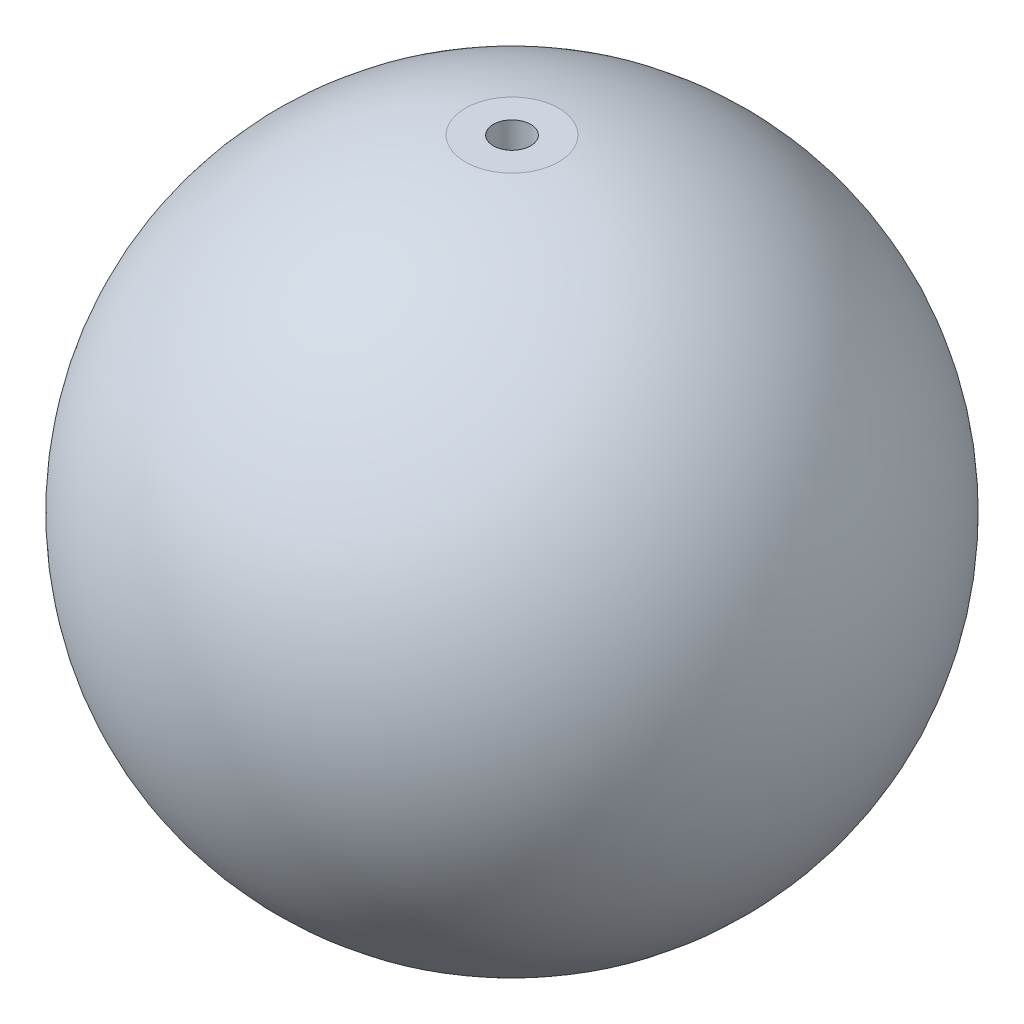
ISO-10303-21;
HEADER;
FILE_DESCRIPTION(('STEP AP214'),'2;1');
FILE_NAME('part.step','',(''),(''),'','','');
FILE_SCHEMA(('AUTOMOTIVE_DESIGN { 1 0 10303 214 1 1 1 1 }'));
ENDSEC;
DATA;
#1=APPLICATION_CONTEXT('core data for automotive mechanical design processes');
#2=APPLICATION_PROTOCOL_DEFINITION('international standard','automotive_design',2000,#1);
#3=PRODUCT_CONTEXT('',#1,'mechanical');
#4=PRODUCT('Part','Part','',(#3));
#5=PRODUCT_RELATED_PRODUCT_CATEGORY('part','',(#4));
#6=PRODUCT_DEFINITION_FORMATION('','',#4);
#7=PRODUCT_DEFINITION_CONTEXT('part definition',#1,'design');
#8=PRODUCT_DEFINITION('design','',#6,#7);
#9=PRODUCT_DEFINITION_SHAPE('','',#8);
#10=(LENGTH_UNIT() NAMED_UNIT(*) SI_UNIT(.MILLI.,.METRE.));
#11=(NAMED_UNIT(*) PLANE_ANGLE_UNIT() SI_UNIT($,.RADIAN.));
#12=(NAMED_UNIT(*) SI_UNIT($,.STERADIAN.) SOLID_ANGLE_UNIT());
#13=UNCERTAINTY_MEASURE_WITH_UNIT(LENGTH_MEASURE(1.E-05),#10,'distance_accuracy_value','');
#14=(GEOMETRIC_REPRESENTATION_CONTEXT(3) GLOBAL_UNCERTAINTY_ASSIGNED_CONTEXT((#13)) GLOBAL_UNIT_ASSIGNED_CONTEXT((#10,
#11,#12)) REPRESENTATION_CONTEXT('',''));
#15=CARTESIAN_POINT('',(0.,0.,0.));
#16=DIRECTION('',(0.,0.,1.));
#17=DIRECTION('',(1.,0.,0.));
#18=AXIS2_PLACEMENT_3D('',#15,#16,#17);
#19=CARTESIAN_POINT('',(0.,0.,0.));
#20=DIRECTION('',(0.,-1.,0.));
#21=DIRECTION('',(0.,0.,-1.));
#22=AXIS2_PLACEMENT_3D('',#19,#20,#21);
#23=CYLINDRICAL_SURFACE('',#22,2.);
#24=CARTESIAN_POINT('',(0.,70.,0.));
#25=DIRECTION('',(0.,-1.,0.));
#26=DIRECTION('',(0.,0.,-1.));
#27=AXIS2_PLACEMENT_3D('',#24,#25,#26);
#28=CIRCLE('',#27,2.);
#29=CARTESIAN_POINT('',(0.,70.,-2.));
#30=VERTEX_POINT('',#29);
#31=EDGE_CURVE('E10',#30,#30,#28,.T.);
#32=ORIENTED_EDGE('',*,*,#31,.F.);
#33=EDGE_LOOP('',(#32));
#34=FACE_BOUND('',#33,.T.);
#35=CARTESIAN_POINT('',(0.,0.,0.));
#36=DIRECTION('',(0.,-1.,0.));
#37=DIRECTION('',(0.,0.,-1.));
#38=AXIS2_PLACEMENT_3D('',#35,#36,#37);
#39=CIRCLE('',#38,2.);
#40=CARTESIAN_POINT('',(0.,0.,-2.));
#41=VERTEX_POINT('',#40);
#42=EDGE_CURVE('E51',#41,#41,#39,.T.);
#43=ORIENTED_EDGE('',*,*,#42,.T.);
#44=EDGE_LOOP('',(#43));
#45=FACE_BOUND('',#44,.T.);
#46=ADVANCED_FACE('F36',(#34,#45),#23,.F.);
#47=CARTESIAN_POINT('',(-2.,70.,0.));
#48=DIRECTION('',(0.,-1.,0.));
#49=DIRECTION('',(0.,0.,-1.));
#50=AXIS2_PLACEMENT_3D('',#47,#48,#49);
#51=PLANE('',#50);
#52=CARTESIAN_POINT('',(0.,70.,0.));
#53=DIRECTION('',(0.,-1.,0.));
#54=DIRECTION('',(0.,0.,-1.));
#55=AXIS2_PLACEMENT_3D('',#52,#53,#54);
#56=CIRCLE('',#55,5.);
#57=CARTESIAN_POINT('',(-4.99999999999994,70.,0.));
#58=VERTEX_POINT('',#57);
#59=EDGE_CURVE('E43',#58,#58,#56,.T.);
#60=ORIENTED_EDGE('',*,*,#59,.F.);
#61=EDGE_LOOP('',(#60));
#62=FACE_BOUND('',#61,.T.);
#63=ORIENTED_EDGE('',*,*,#31,.T.);
#64=EDGE_LOOP('',(#63));
#65=FACE_BOUND('',#64,.T.);
#66=ADVANCED_FACE('F82',(#62,#65),#51,.F.);
#67=CARTESIAN_POINT('',(0.,35.,0.));
#68=DIRECTION('',(0.,-1.,0.));
#69=DIRECTION('',(-1.,0.,0.));
#70=AXIS2_PLACEMENT_3D('',#67,#68,#69);
#71=SPHERICAL_SURFACE('',#70,35.3553390593274);
#72=CARTESIAN_POINT('',(0.,0.,0.));
#73=DIRECTION('',(0.,-1.,0.));
#74=DIRECTION('',(0.,0.,-1.));
#75=AXIS2_PLACEMENT_3D('',#72,#73,#74);
#76=CIRCLE('',#75,5.);
#77=CARTESIAN_POINT('',(-5.00000000000001,0.,0.));
#78=VERTEX_POINT('',#77);
#79=EDGE_CURVE('E47',#78,#78,#76,.T.);
#80=CARTESIAN_POINT('',(-5.00000000000001,0.,0.));
#81=CARTESIAN_POINT('',(-5.52095440848552,0.0744135685089497,0.));
#82=CARTESIAN_POINT('',(-6.04024425532509,0.160474469163579,0.));
#83=CARTESIAN_POINT('',(-7.07446643717462,0.355683067627508,0.));
#84=CARTESIAN_POINT('',(-7.58939877218459,0.464830765436809,0.));
#85=CARTESIAN_POINT('',(-8.61387754183718,0.706005091073396,0.));
#86=CARTESIAN_POINT('',(-9.12342397647981,0.838031718900681,0.));
#87=CARTESIAN_POINT('',(-10.1361156216939,1.12469809433786,0.));
#88=CARTESIAN_POINT('',(-10.6392608322654,1.27933784194775,0.));
#89=CARTESIAN_POINT('',(-11.6381468432122,1.61092287037083,0.));
#90=CARTESIAN_POINT('',(-12.1338876435876,1.78786815118401,0.));
#91=CARTESIAN_POINT('',(-13.1169765763337,2.16371130640558,0.));
#92=CARTESIAN_POINT('',(-13.6043247087045,2.36260918081396,0.));
#93=CARTESIAN_POINT('',(-14.5696567342102,2.78196105687313,0.));
#94=CARTESIAN_POINT('',(-15.047640627345,3.00241505852392,0.));
#95=CARTESIAN_POINT('',(-15.9932912833963,3.46443968553332,0.));
#96=CARTESIAN_POINT('',(-16.4609580463127,3.70601031089193,0.));
#97=CARTESIAN_POINT('',(-17.3850421156326,4.20978660138531,0.));
#98=CARTESIAN_POINT('',(-17.8414594220361,4.47199226652009,0.));
#99=CARTESIAN_POINT('',(-18.7421346794571,5.01651591070964,0.));
#100=CARTESIAN_POINT('',(-19.1863926304744,5.29883388976442,0.));
#101=CARTESIAN_POINT('',(-20.0618635185237,5.8830193418901,0.));
#102=CARTESIAN_POINT('',(-20.4930764555557,6.18488681496101,0.));
#103=CARTESIAN_POINT('',(-21.3415976632225,6.80756946163662,0.));
#104=CARTESIAN_POINT('',(-21.7589059338574,7.12838463524132,0.));
#105=CARTESIAN_POINT('',(-22.5787858762038,7.7883231160556,0.));
#106=CARTESIAN_POINT('',(-22.9813575479151,8.12744642326517,0.));
#107=CARTESIAN_POINT('',(-23.7709617383082,8.8233251058227,0.));
#108=CARTESIAN_POINT('',(-24.1579942569898,9.18008048117065,0.));
#109=CARTESIAN_POINT('',(-24.9157485655781,9.91051208381332,0.));
#110=CARTESIAN_POINT('',(-25.2864703554849,10.284188311108,0.));
#111=CARTESIAN_POINT('',(-26.0108641473298,11.0477166685776,0.));
#112=CARTESIAN_POINT('',(-26.3645361492679,11.4375687987524,0.));
#113=CARTESIAN_POINT('',(-27.0541252958982,12.2326717651494,0.));
#114=CARTESIAN_POINT('',(-27.3900424405902,12.6379226013716,0.));
#115=CARTESIAN_POINT('',(-28.0434521989705,13.4630150846588,0.));
#116=CARTESIAN_POINT('',(-28.3609448126588,13.8828567317237,0.));
#117=CARTESIAN_POINT('',(-28.9768725658339,14.7362938537147,0.));
#118=CARTESIAN_POINT('',(-29.2753077053209,15.1698893286406,0.));
#119=CARTESIAN_POINT('',(-29.8525255592716,16.0499697041768,0.));
#120=CARTESIAN_POINT('',(-30.1313082737354,16.4964546047871,0.));
#121=CARTESIAN_POINT('',(-30.668665505269,17.4014237335657,0.));
#122=CARTESIAN_POINT('',(-30.9272400223387,17.8599079617339,0.));
#123=CARTESIAN_POINT('',(-31.4236653731338,18.7879617260231,0.));
#124=CARTESIAN_POINT('',(-31.6615162068593,19.2575312621442,0.));
#125=CARTESIAN_POINT('',(-32.1160200190932,20.206819523416,0.));
#126=CARTESIAN_POINT('',(-32.3326729976016,20.6865382485667,0.));
#127=CARTESIAN_POINT('',(-32.7443491869001,21.6551685358736,0.));
#128=CARTESIAN_POINT('',(-32.9393723976901,22.1440800980298,0.));
#129=CARTESIAN_POINT('',(-33.3074002594686,23.1301213807752,0.));
#130=CARTESIAN_POINT('',(-33.4804049104572,23.6272511013644,0.));
#131=CARTESIAN_POINT('',(-33.8040507560518,24.6287376389439,0.));
#132=CARTESIAN_POINT('',(-33.9546919506578,25.1330944559341,0.));
#133=CARTESIAN_POINT('',(-34.233310569983,26.1480297165734,0.));
#134=CARTESIAN_POINT('',(-34.3612879947023,26.6586081602224,0.));
#135=CARTESIAN_POINT('',(-34.5943239425221,27.6849688011996,0.));
#136=CARTESIAN_POINT('',(-34.6993824656227,28.2007509985279,0.));
#137=CARTESIAN_POINT('',(-34.886371168868,29.2364908998459,0.));
#138=CARTESIAN_POINT('',(-34.9683013490127,29.7564486038356,0.));
#139=CARTESIAN_POINT('',(-35.1088700329397,30.7995029473013,0.));
#140=CARTESIAN_POINT('',(-35.1675085367219,31.3225995867772,0.));
#141=CARTESIAN_POINT('',(-35.261376968064,32.3708889723578,0.));
#142=CARTESIAN_POINT('',(-35.2966068956237,32.8960817184624,0.));
#143=CARTESIAN_POINT('',(-35.3435879412554,33.9475163097114,0.));
#144=CARTESIAN_POINT('',(-35.3553390593274,34.4737581548557,0.));
#145=CARTESIAN_POINT('',(-35.3553390593274,35.5262418451443,0.));
#146=CARTESIAN_POINT('',(-35.3435879412554,36.0524836902886,0.));
#147=CARTESIAN_POINT('',(-35.2966068956237,37.1039182815376,0.));
#148=CARTESIAN_POINT('',(-35.2613769680639,37.6291110276423,0.));
#149=CARTESIAN_POINT('',(-35.1675085367219,38.6774004132229,0.));
#150=CARTESIAN_POINT('',(-35.1088700329397,39.2004970526988,0.));
#151=CARTESIAN_POINT('',(-34.9683013490127,40.2435513961645,0.));
#152=CARTESIAN_POINT('',(-34.886371168868,40.7635091001542,0.));
#153=CARTESIAN_POINT('',(-34.6993824656227,41.7992490014722,0.));
#154=CARTESIAN_POINT('',(-34.5943239425221,42.3150311988004,0.));
#155=CARTESIAN_POINT('',(-34.3612879947023,43.3413918397777,0.));
#156=CARTESIAN_POINT('',(-34.233310569983,43.8519702834267,0.));
#157=CARTESIAN_POINT('',(-33.9546919506577,44.8669055440659,0.));
#158=CARTESIAN_POINT('',(-33.8040507560517,45.3712623610561,0.));
#159=CARTESIAN_POINT('',(-33.4804049104572,46.3727488986356,0.));
#160=CARTESIAN_POINT('',(-33.3074002594686,46.8698786192249,0.));
#161=CARTESIAN_POINT('',(-32.9393723976901,47.8559199019703,0.));
#162=CARTESIAN_POINT('',(-32.7443491869,48.3448314641265,0.));
#163=CARTESIAN_POINT('',(-32.3326729976016,49.3134617514334,0.));
#164=CARTESIAN_POINT('',(-32.1160200190932,49.7931804765841,0.));
#165=CARTESIAN_POINT('',(-31.6615162068593,50.7424687378559,0.));
#166=CARTESIAN_POINT('',(-31.4236653731338,51.2120382739769,0.));
#167=CARTESIAN_POINT('',(-30.9272400223387,52.1400920382662,0.));
#168=CARTESIAN_POINT('',(-30.668665505269,52.5985762664344,0.));
#169=CARTESIAN_POINT('',(-30.1313082737354,53.5035453952129,0.));
#170=CARTESIAN_POINT('',(-29.8525255592716,53.9500302958232,0.));
#171=CARTESIAN_POINT('',(-29.2753077053208,54.8301106713595,0.));
#172=CARTESIAN_POINT('',(-28.9768725658339,55.2637061462854,0.));
#173=CARTESIAN_POINT('',(-28.3609448126587,56.1171432682763,0.));
#174=CARTESIAN_POINT('',(-28.0434521989705,56.5369849153413,0.));
#175=CARTESIAN_POINT('',(-27.3900424405902,57.3620773986285,0.));
#176=CARTESIAN_POINT('',(-27.0541252958981,57.7673282348506,0.));
#177=CARTESIAN_POINT('',(-26.3645361492679,58.5624312012476,0.));
#178=CARTESIAN_POINT('',(-26.0108641473297,58.9522833314224,0.));
#179=CARTESIAN_POINT('',(-25.2864703554848,59.715811688892,0.));
#180=CARTESIAN_POINT('',(-24.9157485655781,60.0894879161867,0.));
#181=CARTESIAN_POINT('',(-24.1579942569897,60.8199195188294,0.));
#182=CARTESIAN_POINT('',(-23.7709617383081,61.1766748941774,0.));
#183=CARTESIAN_POINT('',(-22.9813575479151,61.8725535767349,0.));
#184=CARTESIAN_POINT('',(-22.5787858762037,62.2116768839445,0.));
#185=CARTESIAN_POINT('',(-21.7589059338574,62.8716153647587,0.));
#186=CARTESIAN_POINT('',(-21.3415976632225,63.1924305383634,0.));
#187=CARTESIAN_POINT('',(-20.4930764555556,63.815113185039,0.));
#188=CARTESIAN_POINT('',(-20.0618635185237,64.11698065811,0.));
#189=CARTESIAN_POINT('',(-19.1863926304744,64.7011661102356,0.));
#190=CARTESIAN_POINT('',(-18.742134679457,64.9834840892904,0.));
#191=CARTESIAN_POINT('',(-17.8414594220361,65.52800773348,0.));
#192=CARTESIAN_POINT('',(-17.3850421156325,65.7902133986147,0.));
#193=CARTESIAN_POINT('',(-16.4609580463126,66.2939896891081,0.));
#194=CARTESIAN_POINT('',(-15.9932912833962,66.5355603144667,0.));
#195=CARTESIAN_POINT('',(-15.047640627345,66.9975849414761,0.));
#196=CARTESIAN_POINT('',(-14.5696567342101,67.2180389431269,0.));
#197=CARTESIAN_POINT('',(-13.6043247087044,67.6373908191861,0.));
#198=CARTESIAN_POINT('',(-13.1169765763336,67.8362886935944,0.));
#199=CARTESIAN_POINT('',(-12.1338876435875,68.212131848816,0.));
#200=CARTESIAN_POINT('',(-11.6381468432122,68.3890771296292,0.));
#201=CARTESIAN_POINT('',(-10.6392608322654,68.7206621580523,0.));
#202=CARTESIAN_POINT('',(-10.1361156216939,68.8753019056622,0.));
#203=CARTESIAN_POINT('',(-9.12342397647975,69.1619682810993,0.));
#204=CARTESIAN_POINT('',(-8.61387754183712,69.2939949089266,0.));
#205=CARTESIAN_POINT('',(-7.58939877218453,69.5351692345632,0.));
#206=CARTESIAN_POINT('',(-7.07446643717456,69.6443169323725,0.));
#207=CARTESIAN_POINT('',(-6.04024425532502,69.8395255308364,0.));
#208=CARTESIAN_POINT('',(-5.52095440848545,69.9255864314911,0.));
#209=CARTESIAN_POINT('',(-4.99999999999994,70.,0.));
#210=B_SPLINE_CURVE_WITH_KNOTS('',3,(#80,#81,#82,#83,#84,#85,#86,#87,#88,#89,#90,#91,#92,#93,
#94,#95,#96,#97,#98,#99,#100,#101,#102,#103,#104,#105,#106,#107,#108,#109,#110,#111,#112,#113,
#114,#115,#116,#117,#118,#119,#120,#121,#122,#123,#124,#125,#126,#127,#128,#129,#130,#131,#132,
#133,#134,#135,#136,#137,#138,#139,#140,#141,#142,#143,#144,#145,#146,#147,#148,#149,#150,#151,
#152,#153,#154,#155,#156,#157,#158,#159,#160,#161,#162,#163,#164,#165,#166,#167,#168,#169,#170,
#171,#172,#173,#174,#175,#176,#177,#178,#179,#180,#181,#182,#183,#184,#185,#186,#187,#188,#189,
#190,#191,#192,#193,#194,#195,#196,#197,#198,#199,#200,#201,#202,#203,#204,#205,#206,#207,#208,
#209),.UNSPECIFIED.,.F.,.F.,(4,2,2,2,2,2,2,2,2,2,2,2,2,2,2,2,2,2,2,2,2,2,2,2,2,2,2,2,2,2,2,2,2,
2,2,2,2,2,2,2,2,2,2,2,2,2,2,2,2,2,2,2,2,2,2,2,2,2,2,2,2,2,2,2,4),(0.,1.57859441440465,
3.15718882880929,4.73578324321394,6.31437765761859,7.89297207202323,9.47156648642788,
11.0501609008325,12.6287553152372,14.2073497296418,15.7859441440465,17.3645385584511,
18.9431329728558,20.5217273872604,22.1003218016651,23.6789162160697,25.2575106304744,
26.836105044879,28.4146994592836,29.9932938736883,31.5718882880929,33.1504827024976,
34.7290771169022,36.3076715313069,37.8862659457115,39.4648603601162,41.0434547745208,
42.6220491889255,44.2006436033301,45.7792380177348,47.3578324321394,48.9364268465441,
50.5150212609487,52.0936156753534,53.672210089758,55.2508045041627,56.8293989185673,
58.4079933329719,59.9865877473766,61.5651821617812,63.1437765761859,64.7223709905905,
66.3009654049952,67.8795598193998,69.4581542338045,71.0367486482091,72.6153430626138,
74.1939374770184,75.7725318914231,77.3511263058277,78.9297207202324,80.508315134637,
82.0869095490417,83.6655039634463,85.2440983778509,86.8226927922556,88.4012872066602,
89.9798816210649,91.5584760354695,93.1370704498742,94.7156648642788,96.2942592786835,
97.8728536930881,99.4514481074928,101.030042521897),.UNSPECIFIED.);
#211=EDGE_CURVE('BSEAM79',#78,#58,#210,.T.);
#212=ORIENTED_EDGE('',*,*,#79,.F.);
#213=ORIENTED_EDGE('',*,*,#59,.T.);
#214=ORIENTED_EDGE('',*,*,#211,.T.);
#215=ORIENTED_EDGE('',*,*,#211,.F.);
#216=EDGE_LOOP('',(#212,#214,#213,#215));
#217=FACE_BOUND('',#216,.T.);
#218=ADVANCED_FACE('F79',(#217),#71,.T.);
#219=CARTESIAN_POINT('',(-2.,0.,0.));
#220=DIRECTION('',(0.,1.,0.));
#221=DIRECTION('',(0.,0.,1.));
#222=AXIS2_PLACEMENT_3D('',#219,#220,#221);
#223=PLANE('',#222);
#224=ORIENTED_EDGE('',*,*,#42,.F.);
#225=EDGE_LOOP('',(#224));
#226=FACE_BOUND('',#225,.T.);
#227=ORIENTED_EDGE('',*,*,#79,.T.);
#228=EDGE_LOOP('',(#227));
#229=FACE_BOUND('',#228,.T.);
#230=ADVANCED_FACE('F76',(#226,#229),#223,.F.);
#231=CLOSED_SHELL('',(#46,#66,#218,#230));
#232=CARTESIAN_POINT('',(0.,35.,0.));
#233=DIRECTION('',(0.,-1.,0.));
#234=DIRECTION('',(-1.,0.,0.));
#235=AXIS2_PLACEMENT_3D('',#232,#233,#234);
#236=SPHERICAL_SURFACE('',#235,32.3553390593274);
#237=CARTESIAN_POINT('',(0.,3.03333039486228,0.));
#238=DIRECTION('',(0.,-1.,0.));
#239=DIRECTION('',(0.,0.,-1.));
#240=AXIS2_PLACEMENT_3D('',#237,#238,#239);
#241=CIRCLE('',#240,5.);
#242=CARTESIAN_POINT('',(-5.00000000000004,3.03333039486228,0.));
#243=VERTEX_POINT('',#242);
#244=EDGE_CURVE('E59',#243,#243,#241,.T.);
#245=CARTESIAN_POINT('',(0.,66.9666696051377,0.));
#246=DIRECTION('',(0.,-1.,0.));
#247=DIRECTION('',(0.,0.,-1.));
#248=AXIS2_PLACEMENT_3D('',#245,#246,#247);
#249=CIRCLE('',#248,5.);
#250=CARTESIAN_POINT('',(-4.99999999999996,66.9666696051377,0.));
#251=VERTEX_POINT('',#250);
#252=EDGE_CURVE('E56',#251,#251,#249,.T.);
#253=CARTESIAN_POINT('',(-5.00000000000004,3.03333039486228,0.));
#254=CARTESIAN_POINT('',(-5.47139014585291,3.10705440195456,0.));
#255=CARTESIAN_POINT('',(-5.94114659057069,3.19121952938153,0.));
#256=CARTESIAN_POINT('',(-6.87647933307117,3.38023541196426,0.));
#257=CARTESIAN_POINT('',(-7.34205563085386,3.48508616712002,0.));
#258=CARTESIAN_POINT('',(-8.2681153348193,3.71527669221971,0.));
#259=CARTESIAN_POINT('',(-8.72859874100203,3.84061646216363,0.));
#260=CARTESIAN_POINT('',(-9.64357207430554,4.11153746636259,0.));
#261=CARTESIAN_POINT('',(-10.0980620014263,4.25711870061763,0.));
#262=CARTESIAN_POINT('',(-11.0001589296187,4.56823838157731,0.));
#263=CARTESIAN_POINT('',(-11.4477659306903,4.73377682828196,0.));
#264=CARTESIAN_POINT('',(-12.3352211853147,5.08448685233222,0.));
#265=CARTESIAN_POINT('',(-12.7750694388675,5.26965842967782,0.));
#266=CARTESIAN_POINT('',(-13.6461465167456,5.65927242473284,0.));
#267=CARTESIAN_POINT('',(-14.0773753410709,5.86371484244224,0.));
#268=CARTESIAN_POINT('',(-14.9303697561458,6.29147046383572,0.));
#269=CARTESIAN_POINT('',(-15.3521353468954,6.51478366751979,0.));
#270=CARTESIAN_POINT('',(-16.1853780046199,6.97984389605489,0.));
#271=CARTESIAN_POINT('',(-16.5968550715949,7.22159092090592,0.));
#272=CARTESIAN_POINT('',(-17.4087155244448,7.72304575258511,0.));
#273=CARTESIAN_POINT('',(-17.8090989103197,7.98275355941327,0.));
#274=CARTESIAN_POINT('',(-18.5979885509808,8.51962177218337,0.));
#275=CARTESIAN_POINT('',(-18.9864948057668,8.79678217812532,0.));
#276=CARTESIAN_POINT('',(-19.7508699748882,9.36801325560894,0.));
#277=CARTESIAN_POINT('',(-20.1267388892235,9.66208392715061,0.));
#278=CARTESIAN_POINT('',(-20.865103896174,10.2665601132451,0.));
#279=CARTESIAN_POINT('',(-21.2275999887892,10.5769656277979,0.));
#280=CARTESIAN_POINT('',(-21.9385100382952,11.2135041141112,0.));
#281=CARTESIAN_POINT('',(-22.2869239951859,11.5396370858719,0.));
#282=CARTESIAN_POINT('',(-22.9689880144476,12.206992326111,0.));
#283=CARTESIAN_POINT('',(-23.3026380768186,12.5482145945895,0.));
#284=CARTESIAN_POINT('',(-23.9545214374873,13.245080741801,0.));
#285=CARTESIAN_POINT('',(-24.2727547357851,13.600724620534,0.));
#286=CARTESIAN_POINT('',(-24.8931818654976,14.3257380823145,0.));
#287=CARTESIAN_POINT('',(-25.1953756969123,14.695107665362,0.));
#288=CARTESIAN_POINT('',(-25.7831325752655,15.4468497720679,0.));
#289=CARTESIAN_POINT('',(-26.0686956222041,15.8292222957264,0.));
#290=CARTESIAN_POINT('',(-26.6226321562894,16.6062220764546,0.));
#291=CARTESIAN_POINT('',(-26.8910056434361,17.0008493335245,0.));
#292=CARTESIAN_POINT('',(-27.4100379182824,17.801586394434,0.));
#293=CARTESIAN_POINT('',(-27.660696705982,18.2076961982737,0.));
#294=CARTESIAN_POINT('',(-28.1438091055061,19.030603697615,0.));
#295=CARTESIAN_POINT('',(-28.3762627173306,19.4474013931167,0.));
#296=CARTESIAN_POINT('',(-28.8225099116431,20.2908691071487,0.));
#297=CARTESIAN_POINT('',(-29.0363034941311,20.7175391256791,0.));
#298=CARTESIAN_POINT('',(-29.4448122893101,21.5799165994733,0.));
#299=CARTESIAN_POINT('',(-29.639527502001,22.0156240547371,0.));
#300=CARTESIAN_POINT('',(-30.0094985487138,22.8952238317041,0.));
#301=CARTESIAN_POINT('',(-30.1847543827355,23.3391161534074,0.));
#302=CARTESIAN_POINT('',(-30.5154637403649,24.2342170772269,0.));
#303=CARTESIAN_POINT('',(-30.6709172639725,24.6854256793432,0.));
#304=CARTESIAN_POINT('',(-30.9617178171871,25.5942762618353,0.));
#305=CARTESIAN_POINT('',(-31.0970648467942,26.0519182422111,0.));
#306=CARTESIAN_POINT('',(-31.3473875717912,26.9727400905598,0.));
#307=CARTESIAN_POINT('',(-31.4623632671812,27.4359199585326,0.));
#308=CARTESIAN_POINT('',(-31.6717183451231,28.3669112551547,0.));
#309=CARTESIAN_POINT('',(-31.766097727675,28.834722683804,0.));
#310=CARTESIAN_POINT('',(-31.9340755031422,29.7740617120549,0.));
#311=CARTESIAN_POINT('',(-32.0076738960575,30.2455893116565,0.));
#312=CARTESIAN_POINT('',(-32.1339456786417,31.1914380204726,0.));
#313=CARTESIAN_POINT('',(-32.1866190683106,31.6657591296872,0.));
#314=CARTESIAN_POINT('',(-32.2709377757791,32.6162667301918,0.));
#315=CARTESIAN_POINT('',(-32.3025830935788,33.0924532214818,0.));
#316=CARTESIAN_POINT('',(-32.3447837353529,34.0457598085146,0.));
#317=CARTESIAN_POINT('',(-32.3553390593274,34.5228799042573,0.));
#318=CARTESIAN_POINT('',(-32.3553390593274,35.4771200957428,0.));
#319=CARTESIAN_POINT('',(-32.3447837353529,35.9542401914855,0.));
#320=CARTESIAN_POINT('',(-32.3025830935788,36.9075467785183,0.));
#321=CARTESIAN_POINT('',(-32.2709377757791,37.3837332698083,0.));
#322=CARTESIAN_POINT('',(-32.1866190683106,38.3342408703129,0.));
#323=CARTESIAN_POINT('',(-32.1339456786417,38.8085619795275,0.));
#324=CARTESIAN_POINT('',(-32.0076738960575,39.7544106883436,0.));
#325=CARTESIAN_POINT('',(-31.9340755031422,40.2259382879452,0.));
#326=CARTESIAN_POINT('',(-31.766097727675,41.1652773161961,0.));
#327=CARTESIAN_POINT('',(-31.671718345123,41.6330887448454,0.));
#328=CARTESIAN_POINT('',(-31.4623632671812,42.5640800414675,0.));
#329=CARTESIAN_POINT('',(-31.3473875717912,43.0272599094403,0.));
#330=CARTESIAN_POINT('',(-31.0970648467942,43.948081757789,0.));
#331=CARTESIAN_POINT('',(-30.9617178171871,44.4057237381648,0.));
#332=CARTESIAN_POINT('',(-30.6709172639724,45.3145743206569,0.));
#333=CARTESIAN_POINT('',(-30.5154637403649,45.7657829227732,0.));
#334=CARTESIAN_POINT('',(-30.1847543827355,46.6608838465927,0.));
#335=CARTESIAN_POINT('',(-30.0094985487137,47.104776168296,0.));
#336=CARTESIAN_POINT('',(-29.639527502001,47.984375945263,0.));
#337=CARTESIAN_POINT('',(-29.44481228931,48.4200834005268,0.));
#338=CARTESIAN_POINT('',(-29.0363034941311,49.282460874321,0.));
#339=CARTESIAN_POINT('',(-28.8225099116431,49.7091308928514,0.));
#340=CARTESIAN_POINT('',(-28.3762627173306,50.5525986068834,0.));
#341=CARTESIAN_POINT('',(-28.1438091055061,50.9693963023851,0.));
#342=CARTESIAN_POINT('',(-27.660696705982,51.7923038017264,0.));
#343=CARTESIAN_POINT('',(-27.4100379182824,52.1984136055661,0.));
#344=CARTESIAN_POINT('',(-26.891005643436,52.9991506664756,0.));
#345=CARTESIAN_POINT('',(-26.6226321562893,53.3937779235454,0.));
#346=CARTESIAN_POINT('',(-26.068695622204,54.1707777042737,0.));
#347=CARTESIAN_POINT('',(-25.7831325752655,54.5531502279322,0.));
#348=CARTESIAN_POINT('',(-25.1953756969122,55.3048923346381,0.));
#349=CARTESIAN_POINT('',(-24.8931818654975,55.6742619176855,0.));
#350=CARTESIAN_POINT('',(-24.2727547357851,56.399275379466,0.));
#351=CARTESIAN_POINT('',(-23.9545214374873,56.754919258199,0.));
#352=CARTESIAN_POINT('',(-23.3026380768185,57.4517854054106,0.));
#353=CARTESIAN_POINT('',(-22.9689880144476,57.7930076738891,0.));
#354=CARTESIAN_POINT('',(-22.2869239951859,58.4603629141282,0.));
#355=CARTESIAN_POINT('',(-21.9385100382951,58.7864958858888,0.));
#356=CARTESIAN_POINT('',(-21.2275999887892,59.4230343722022,0.));
#357=CARTESIAN_POINT('',(-20.8651038961739,59.733439886755,0.));
#358=CARTESIAN_POINT('',(-20.1267388892234,60.3379160728494,0.));
#359=CARTESIAN_POINT('',(-19.7508699748881,60.6319867443911,0.));
#360=CARTESIAN_POINT('',(-18.9864948057667,61.2032178218747,0.));
#361=CARTESIAN_POINT('',(-18.5979885509807,61.4803782278167,0.));
#362=CARTESIAN_POINT('',(-17.8090989103197,62.0172464405868,0.));
#363=CARTESIAN_POINT('',(-17.4087155244447,62.2769542474149,0.));
#364=CARTESIAN_POINT('',(-16.5968550715948,62.7784090790941,0.));
#365=CARTESIAN_POINT('',(-16.1853780046199,63.0201561039452,0.));
#366=CARTESIAN_POINT('',(-15.3521353468953,63.4852163324803,0.));
#367=CARTESIAN_POINT('',(-14.9303697561457,63.7085295361643,0.));
#368=CARTESIAN_POINT('',(-14.0773753410708,64.1362851575578,0.));
#369=CARTESIAN_POINT('',(-13.6461465167455,64.3407275752672,0.));
#370=CARTESIAN_POINT('',(-12.7750694388674,64.7303415703222,0.));
#371=CARTESIAN_POINT('',(-12.3352211853146,64.9155131476678,0.));
#372=CARTESIAN_POINT('',(-11.4477659306902,65.2662231717181,0.));
#373=CARTESIAN_POINT('',(-11.0001589296186,65.4317616184227,0.));
#374=CARTESIAN_POINT('',(-10.0980620014262,65.7428812993824,0.));
#375=CARTESIAN_POINT('',(-9.64357207430545,65.8884625336375,0.));
#376=CARTESIAN_POINT('',(-8.72859874100195,66.1593835378364,0.));
#377=CARTESIAN_POINT('',(-8.26811533481922,66.2847233077803,0.));
#378=CARTESIAN_POINT('',(-7.34205563085378,66.51491383288,0.));
#379=CARTESIAN_POINT('',(-6.87647933307108,66.6197645880358,0.));
#380=CARTESIAN_POINT('',(-5.9411465905706,66.8087804706185,0.));
#381=CARTESIAN_POINT('',(-5.47139014585283,66.8929455980455,0.));
#382=CARTESIAN_POINT('',(-4.99999999999996,66.9666696051377,0.));
#383=B_SPLINE_CURVE_WITH_KNOTS('',3,(#253,#254,#255,#256,#257,#258,#259,#260,#261,#262,#263,
#264,#265,#266,#267,#268,#269,#270,#271,#272,#273,#274,#275,#276,#277,#278,#279,#280,#281,#282,
#283,#284,#285,#286,#287,#288,#289,#290,#291,#292,#293,#294,#295,#296,#297,#298,#299,#300,#301,
#302,#303,#304,#305,#306,#307,#308,#309,#310,#311,#312,#313,#314,#315,#316,#317,#318,#319,#320,
#321,#322,#323,#324,#325,#326,#327,#328,#329,#330,#331,#332,#333,#334,#335,#336,#337,#338,#339,
#340,#341,#342,#343,#344,#345,#346,#347,#348,#349,#350,#351,#352,#353,#354,#355,#356,#357,#358,
#359,#360,#361,#362,#363,#364,#365,#366,#367,#368,#369,#370,#371,#372,#373,#374,#375,#376,#377,
#378,#379,#380,#381,#382),.UNSPECIFIED.,.F.,.F.,(4,2,2,2,2,2,2,2,2,2,2,2,2,2,2,2,2,2,2,2,2,2,2,
2,2,2,2,2,2,2,2,2,2,2,2,2,2,2,2,2,2,2,2,2,2,2,2,2,2,2,2,2,2,2,2,2,2,2,2,2,2,2,2,2,4),(0.,
1.43124360095418,2.86248720190835,4.29373080286253,5.7249744038167,7.15621800477088,
8.58746160572506,10.0187052066792,11.4499488076334,12.8811924085876,14.3124360095418,
15.7436796104959,17.1749232114501,18.6061668124043,20.0374104133585,21.4686540143126,
22.8998976152668,24.331141216221,25.7623848171752,27.1936284181293,28.6248720190835,
30.0561156200377,31.4873592209919,32.918602821946,34.3498464229002,35.7810900238544,
37.2123336248086,38.6435772257627,40.0748208267169,41.5060644276711,42.9373080286253,
44.3685516295794,45.7997952305336,47.2310388314878,48.662282432442,50.0935260333962,
51.5247696343503,52.9560132353045,54.3872568362587,55.8185004372129,57.249744038167,
58.6809876391212,60.1122312400754,61.5434748410296,62.9747184419837,64.4059620429379,
65.8372056438921,67.2684492448463,68.6996928458005,70.1309364467546,71.5621800477088,
72.993423648663,74.4246672496172,75.8559108505713,77.2871544515255,78.7183980524797,
80.1496416534339,81.580885254388,83.0121288553422,84.4433724562964,85.8746160572505,
87.3058596582047,88.7371032591589,90.1683468601131,91.5995904610672),.UNSPECIFIED.);
#384=EDGE_CURVE('BSEAM63',#243,#251,#383,.T.);
#385=ORIENTED_EDGE('',*,*,#244,.T.);
#386=ORIENTED_EDGE('',*,*,#252,.F.);
#387=ORIENTED_EDGE('',*,*,#384,.T.);
#388=ORIENTED_EDGE('',*,*,#384,.F.);
#389=EDGE_LOOP('',(#385,#387,#386,#388));
#390=FACE_BOUND('',#389,.T.);
#391=ADVANCED_FACE('F63',(#390),#236,.F.);
#392=CARTESIAN_POINT('',(0.,0.,0.));
#393=DIRECTION('',(0.,-1.,0.));
#394=DIRECTION('',(0.,0.,-1.));
#395=AXIS2_PLACEMENT_3D('',#392,#393,#394);
#396=CYLINDRICAL_SURFACE('',#395,5.);
#397=ORIENTED_EDGE('',*,*,#252,.T.);
#398=EDGE_LOOP('',(#397));
#399=FACE_BOUND('',#398,.T.);
#400=ORIENTED_EDGE('',*,*,#244,.F.);
#401=EDGE_LOOP('',(#400));
#402=FACE_BOUND('',#401,.T.);
#403=ADVANCED_FACE('F66',(#399,#402),#396,.T.);
#404=CLOSED_SHELL('',(#391,#403));
#405=ORIENTED_CLOSED_SHELL('',*,#404,.T.);
#406=BREP_WITH_VOIDS('B2',#231,(#405));
#407=ADVANCED_BREP_SHAPE_REPRESENTATION('',(#18,#406),#14);
#408=SHAPE_DEFINITION_REPRESENTATION(#9,#407);
ENDSEC;
END-ISO-10303-21;
